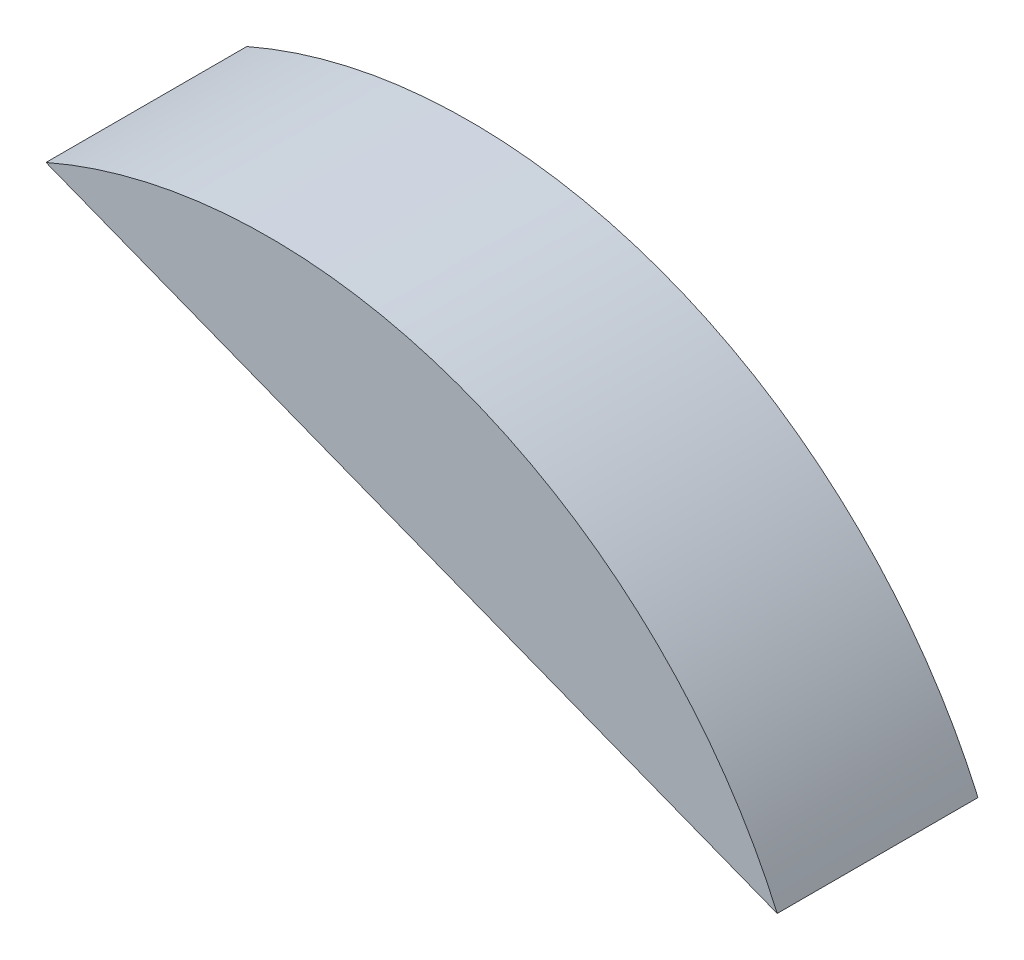
ISO-10303-21;
HEADER;
FILE_DESCRIPTION(('STEP AP214'),'2;1');
FILE_NAME('part.step','',(''),(''),'','','');
FILE_SCHEMA(('AUTOMOTIVE_DESIGN { 1 0 10303 214 1 1 1 1 }'));
ENDSEC;
DATA;
#1=APPLICATION_CONTEXT('core data for automotive mechanical design processes');
#2=APPLICATION_PROTOCOL_DEFINITION('international standard','automotive_design',2000,#1);
#3=PRODUCT_CONTEXT('',#1,'mechanical');
#4=PRODUCT('Part','Part','',(#3));
#5=PRODUCT_RELATED_PRODUCT_CATEGORY('part','',(#4));
#6=PRODUCT_DEFINITION_FORMATION('','',#4);
#7=PRODUCT_DEFINITION_CONTEXT('part definition',#1,'design');
#8=PRODUCT_DEFINITION('design','',#6,#7);
#9=PRODUCT_DEFINITION_SHAPE('','',#8);
#10=(LENGTH_UNIT() NAMED_UNIT(*) SI_UNIT(.MILLI.,.METRE.));
#11=(NAMED_UNIT(*) PLANE_ANGLE_UNIT() SI_UNIT($,.RADIAN.));
#12=(NAMED_UNIT(*) SI_UNIT($,.STERADIAN.) SOLID_ANGLE_UNIT());
#13=UNCERTAINTY_MEASURE_WITH_UNIT(LENGTH_MEASURE(1.E-05),#10,'distance_accuracy_value','');
#14=(GEOMETRIC_REPRESENTATION_CONTEXT(3) GLOBAL_UNCERTAINTY_ASSIGNED_CONTEXT((#13)) GLOBAL_UNIT_ASSIGNED_CONTEXT((#10,
#11,#12)) REPRESENTATION_CONTEXT('',''));
#15=CARTESIAN_POINT('',(0.,0.,0.));
#16=DIRECTION('',(0.,0.,1.));
#17=DIRECTION('',(1.,0.,0.));
#18=AXIS2_PLACEMENT_3D('',#15,#16,#17);
#19=CARTESIAN_POINT('',(-5.137,13.719,7.139));
#20=DIRECTION('',(0.,0.,-1.));
#21=DIRECTION('',(-1.,0.,0.));
#22=AXIS2_PLACEMENT_3D('',#19,#20,#21);
#23=CYLINDRICAL_SURFACE('',#22,19.731);
#24=CARTESIAN_POINT('',(-5.137,13.719,0.));
#25=DIRECTION('',(0.,0.,1.));
#26=DIRECTION('',(1.,0.,0.));
#27=AXIS2_PLACEMENT_3D('',#24,#25,#26);
#28=CIRCLE('',#27,19.731);
#29=CARTESIAN_POINT('',(12.9273076725018,21.6558223687564,0.));
#30=VERTEX_POINT('',#29);
#31=CARTESIAN_POINT('',(-13.0738223687564,31.7833076725018,0.));
#32=VERTEX_POINT('',#31);
#33=EDGE_CURVE('E74',#30,#32,#28,.T.);
#34=ORIENTED_EDGE('',*,*,#33,.T.);
#35=DIRECTION('',(0.,0.,-1.));
#36=VECTOR('',#35,1.);
#37=CARTESIAN_POINT('',(-13.0738223687564,31.7833076725018,7.139));
#38=LINE('',#37,#36);
#39=CARTESIAN_POINT('',(-13.0738223687564,31.7833076725018,7.139));
#40=VERTEX_POINT('',#39);
#41=EDGE_CURVE('E11',#40,#32,#38,.T.);
#42=ORIENTED_EDGE('',*,*,#41,.F.);
#43=CARTESIAN_POINT('',(-5.137,13.719,7.139));
#44=DIRECTION('',(0.,0.,1.));
#45=DIRECTION('',(1.,0.,0.));
#46=AXIS2_PLACEMENT_3D('',#43,#44,#45);
#47=CIRCLE('',#46,19.731);
#48=CARTESIAN_POINT('',(12.9273076725018,21.6558223687564,7.139));
#49=VERTEX_POINT('',#48);
#50=EDGE_CURVE('E72',#49,#40,#47,.T.);
#51=ORIENTED_EDGE('',*,*,#50,.F.);
#52=DIRECTION('',(0.,0.,-1.));
#53=VECTOR('',#52,1.);
#54=CARTESIAN_POINT('',(12.9273076725018,21.6558223687564,7.139));
#55=LINE('',#54,#53);
#56=EDGE_CURVE('E47',#49,#30,#55,.T.);
#57=ORIENTED_EDGE('',*,*,#56,.T.);
#58=EDGE_LOOP('',(#34,#42,#51,#57));
#59=FACE_BOUND('',#58,.T.);
#60=ADVANCED_FACE('F41',(#59),#23,.T.);
#61=CARTESIAN_POINT('',(-13.0738223687564,31.7833076725018,7.139));
#62=DIRECTION('',(0.362942249994704,0.931811635025439,0.));
#63=DIRECTION('',(-0.931811635025439,0.362942249994704,0.));
#64=AXIS2_PLACEMENT_3D('',#61,#62,#63);
#65=PLANE('',#64);
#66=DIRECTION('',(0.931811635025439,-0.362942249994704,0.));
#67=VECTOR('',#66,1.);
#68=CARTESIAN_POINT('',(-13.0738223687564,31.7833076725018,0.));
#69=LINE('',#68,#67);
#70=EDGE_CURVE('E61',#32,#30,#69,.T.);
#71=ORIENTED_EDGE('',*,*,#70,.T.);
#72=ORIENTED_EDGE('',*,*,#56,.F.);
#73=DIRECTION('',(0.931811635025439,-0.362942249994704,0.));
#74=VECTOR('',#73,1.);
#75=CARTESIAN_POINT('',(-13.0738223687564,31.7833076725018,7.139));
#76=LINE('',#75,#74);
#77=EDGE_CURVE('E57',#40,#49,#76,.T.);
#78=ORIENTED_EDGE('',*,*,#77,.F.);
#79=ORIENTED_EDGE('',*,*,#41,.T.);
#80=EDGE_LOOP('',(#71,#72,#78,#79));
#81=FACE_BOUND('',#80,.T.);
#82=ADVANCED_FACE('F70',(#81),#65,.F.);
#83=CARTESIAN_POINT('',(-5.137,13.719,7.139));
#84=DIRECTION('',(0.,0.,1.));
#85=DIRECTION('',(1.,0.,0.));
#86=AXIS2_PLACEMENT_3D('',#83,#84,#85);
#87=PLANE('',#86);
#88=ORIENTED_EDGE('',*,*,#50,.T.);
#89=ORIENTED_EDGE('',*,*,#77,.T.);
#90=EDGE_LOOP('',(#88,#89));
#91=FACE_BOUND('',#90,.T.);
#92=ADVANCED_FACE('F80',(#91),#87,.T.);
#93=CARTESIAN_POINT('',(-5.137,13.719,0.));
#94=DIRECTION('',(0.,0.,1.));
#95=DIRECTION('',(1.,0.,0.));
#96=AXIS2_PLACEMENT_3D('',#93,#94,#95);
#97=PLANE('',#96);
#98=ORIENTED_EDGE('',*,*,#33,.F.);
#99=ORIENTED_EDGE('',*,*,#70,.F.);
#100=EDGE_LOOP('',(#98,#99));
#101=FACE_BOUND('',#100,.T.);
#102=ADVANCED_FACE('F73',(#101),#97,.F.);
#103=CLOSED_SHELL('',(#60,#82,#92,#102));
#104=MANIFOLD_SOLID_BREP('B2',#103);
#105=ADVANCED_BREP_SHAPE_REPRESENTATION('',(#18,#104),#14);
#106=SHAPE_DEFINITION_REPRESENTATION(#9,#105);
ENDSEC;
END-ISO-10303-21;
